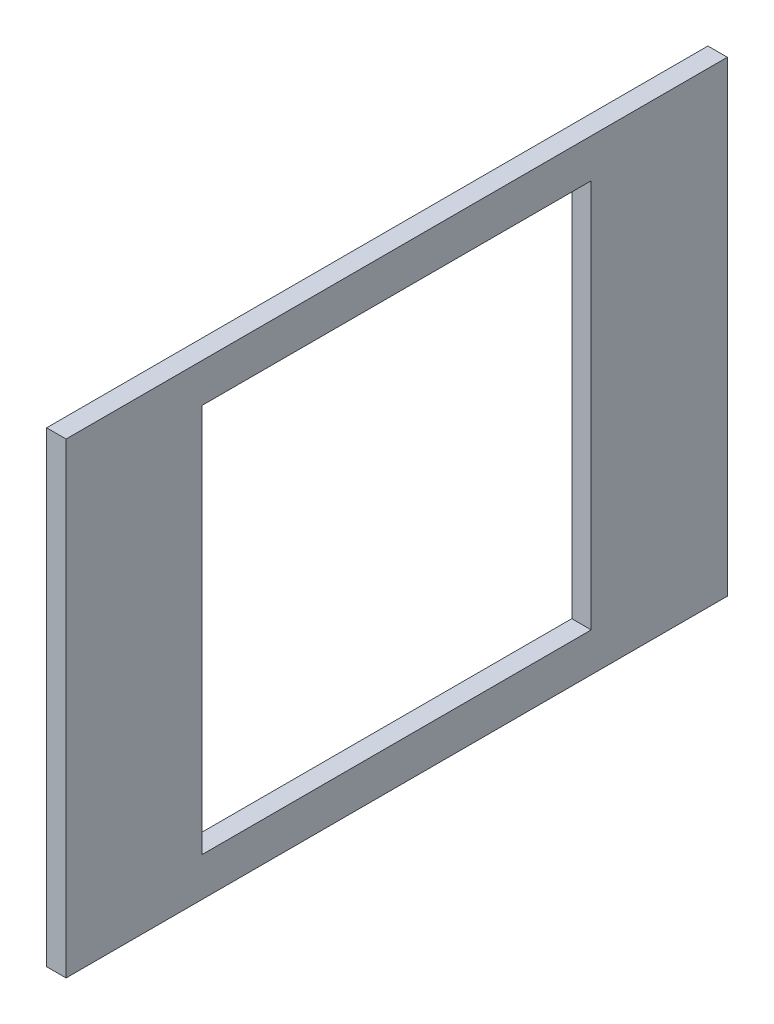
ISO-10303-21;
HEADER;
FILE_DESCRIPTION(('STEP AP214'),'2;1');
FILE_NAME('part.step','',(''),(''),'','','');
FILE_SCHEMA(('AUTOMOTIVE_DESIGN { 1 0 10303 214 1 1 1 1 }'));
ENDSEC;
DATA;
#1=APPLICATION_CONTEXT('core data for automotive mechanical design processes');
#2=APPLICATION_PROTOCOL_DEFINITION('international standard','automotive_design',2000,#1);
#3=PRODUCT_CONTEXT('',#1,'mechanical');
#4=PRODUCT('Part','Part','',(#3));
#5=PRODUCT_RELATED_PRODUCT_CATEGORY('part','',(#4));
#6=PRODUCT_DEFINITION_FORMATION('','',#4);
#7=PRODUCT_DEFINITION_CONTEXT('part definition',#1,'design');
#8=PRODUCT_DEFINITION('design','',#6,#7);
#9=PRODUCT_DEFINITION_SHAPE('','',#8);
#10=(LENGTH_UNIT() NAMED_UNIT(*) SI_UNIT(.MILLI.,.METRE.));
#11=(NAMED_UNIT(*) PLANE_ANGLE_UNIT() SI_UNIT($,.RADIAN.));
#12=(NAMED_UNIT(*) SI_UNIT($,.STERADIAN.) SOLID_ANGLE_UNIT());
#13=UNCERTAINTY_MEASURE_WITH_UNIT(LENGTH_MEASURE(1.E-05),#10,'distance_accuracy_value','');
#14=(GEOMETRIC_REPRESENTATION_CONTEXT(3) GLOBAL_UNCERTAINTY_ASSIGNED_CONTEXT((#13)) GLOBAL_UNIT_ASSIGNED_CONTEXT((#10,
#11,#12)) REPRESENTATION_CONTEXT('',''));
#15=CARTESIAN_POINT('',(0.,0.,0.));
#16=DIRECTION('',(0.,0.,1.));
#17=DIRECTION('',(1.,0.,0.));
#18=AXIS2_PLACEMENT_3D('',#15,#16,#17);
#19=CARTESIAN_POINT('',(12.7,0.,0.));
#20=DIRECTION('',(-1.,0.,0.));
#21=DIRECTION('',(0.,0.,1.));
#22=AXIS2_PLACEMENT_3D('',#19,#20,#21);
#23=PLANE('',#22);
#24=DIRECTION('',(0.,-1.,0.));
#25=VECTOR('',#24,1.);
#26=CARTESIAN_POINT('',(12.7,152.4,215.9));
#27=LINE('',#26,#25);
#28=CARTESIAN_POINT('',(12.7,152.4,215.9));
#29=VERTEX_POINT('',#28);
#30=CARTESIAN_POINT('',(12.7,-152.4,215.9));
#31=VERTEX_POINT('',#30);
#32=EDGE_CURVE('E135',#29,#31,#27,.T.);
#33=ORIENTED_EDGE('',*,*,#32,.T.);
#34=DIRECTION('',(0.,0.,-1.));
#35=VECTOR('',#34,1.);
#36=CARTESIAN_POINT('',(12.7,-152.4,-215.9));
#37=LINE('',#36,#35);
#38=CARTESIAN_POINT('',(12.7,-152.4,-215.9));
#39=VERTEX_POINT('',#38);
#40=EDGE_CURVE('E138',#31,#39,#37,.T.);
#41=ORIENTED_EDGE('',*,*,#40,.T.);
#42=DIRECTION('',(0.,1.,0.));
#43=VECTOR('',#42,1.);
#44=CARTESIAN_POINT('',(12.7,152.4,-215.9));
#45=LINE('',#44,#43);
#46=CARTESIAN_POINT('',(12.7,152.4,-215.9));
#47=VERTEX_POINT('',#46);
#48=EDGE_CURVE('E141',#39,#47,#45,.T.);
#49=ORIENTED_EDGE('',*,*,#48,.T.);
#50=DIRECTION('',(0.,0.,1.));
#51=VECTOR('',#50,1.);
#52=CARTESIAN_POINT('',(12.7,152.4,-215.9));
#53=LINE('',#52,#51);
#54=EDGE_CURVE('E143',#47,#29,#53,.T.);
#55=ORIENTED_EDGE('',*,*,#54,.T.);
#56=EDGE_LOOP('',(#33,#41,#49,#55));
#57=FACE_BOUND('',#56,.T.);
#58=DIRECTION('',(0.,-1.,0.));
#59=VECTOR('',#58,1.);
#60=CARTESIAN_POINT('',(12.7,127.,127.));
#61=LINE('',#60,#59);
#62=CARTESIAN_POINT('',(12.7,127.,127.));
#63=VERTEX_POINT('',#62);
#64=CARTESIAN_POINT('',(12.7,-127.,127.));
#65=VERTEX_POINT('',#64);
#66=EDGE_CURVE('E99',#63,#65,#61,.T.);
#67=ORIENTED_EDGE('',*,*,#66,.F.);
#68=DIRECTION('',(0.,0.,1.));
#69=VECTOR('',#68,1.);
#70=CARTESIAN_POINT('',(12.7,127.,-127.));
#71=LINE('',#70,#69);
#72=CARTESIAN_POINT('',(12.7,127.,-127.));
#73=VERTEX_POINT('',#72);
#74=EDGE_CURVE('E121',#73,#63,#71,.T.);
#75=ORIENTED_EDGE('',*,*,#74,.F.);
#76=DIRECTION('',(0.,1.,0.));
#77=VECTOR('',#76,1.);
#78=CARTESIAN_POINT('',(12.7,127.,-127.));
#79=LINE('',#78,#77);
#80=CARTESIAN_POINT('',(12.7,-127.,-127.));
#81=VERTEX_POINT('',#80);
#82=EDGE_CURVE('E119',#81,#73,#79,.T.);
#83=ORIENTED_EDGE('',*,*,#82,.F.);
#84=DIRECTION('',(0.,0.,-1.));
#85=VECTOR('',#84,1.);
#86=CARTESIAN_POINT('',(12.7,-127.,-127.));
#87=LINE('',#86,#85);
#88=EDGE_CURVE('E107',#65,#81,#87,.T.);
#89=ORIENTED_EDGE('',*,*,#88,.F.);
#90=EDGE_LOOP('',(#67,#75,#83,#89));
#91=FACE_BOUND('',#90,.T.);
#92=ADVANCED_FACE('F34',(#57,#91),#23,.F.);
#93=CARTESIAN_POINT('',(0.,0.,0.));
#94=DIRECTION('',(-1.,0.,0.));
#95=DIRECTION('',(0.,0.,1.));
#96=AXIS2_PLACEMENT_3D('',#93,#94,#95);
#97=PLANE('',#96);
#98=DIRECTION('',(0.,-1.,0.));
#99=VECTOR('',#98,1.);
#100=CARTESIAN_POINT('',(0.,152.4,215.9));
#101=LINE('',#100,#99);
#102=CARTESIAN_POINT('',(0.,152.4,215.9));
#103=VERTEX_POINT('',#102);
#104=CARTESIAN_POINT('',(0.,-152.4,215.9));
#105=VERTEX_POINT('',#104);
#106=EDGE_CURVE('E115',#103,#105,#101,.T.);
#107=ORIENTED_EDGE('',*,*,#106,.F.);
#108=DIRECTION('',(0.,0.,1.));
#109=VECTOR('',#108,1.);
#110=CARTESIAN_POINT('',(0.,152.4,-215.9));
#111=LINE('',#110,#109);
#112=CARTESIAN_POINT('',(0.,152.4,-215.9));
#113=VERTEX_POINT('',#112);
#114=EDGE_CURVE('E139',#113,#103,#111,.T.);
#115=ORIENTED_EDGE('',*,*,#114,.F.);
#116=DIRECTION('',(0.,1.,0.));
#117=VECTOR('',#116,1.);
#118=CARTESIAN_POINT('',(0.,152.4,-215.9));
#119=LINE('',#118,#117);
#120=CARTESIAN_POINT('',(0.,-152.4,-215.9));
#121=VERTEX_POINT('',#120);
#122=EDGE_CURVE('E150',#121,#113,#119,.T.);
#123=ORIENTED_EDGE('',*,*,#122,.F.);
#124=DIRECTION('',(0.,0.,-1.));
#125=VECTOR('',#124,1.);
#126=CARTESIAN_POINT('',(0.,-152.4,-215.9));
#127=LINE('',#126,#125);
#128=EDGE_CURVE('E148',#105,#121,#127,.T.);
#129=ORIENTED_EDGE('',*,*,#128,.F.);
#130=EDGE_LOOP('',(#107,#115,#123,#129));
#131=FACE_BOUND('',#130,.T.);
#132=DIRECTION('',(0.,0.,1.));
#133=VECTOR('',#132,1.);
#134=CARTESIAN_POINT('',(0.,127.,-127.));
#135=LINE('',#134,#133);
#136=CARTESIAN_POINT('',(0.,127.,-127.));
#137=VERTEX_POINT('',#136);
#138=CARTESIAN_POINT('',(0.,127.,127.));
#139=VERTEX_POINT('',#138);
#140=EDGE_CURVE('E108',#137,#139,#135,.T.);
#141=ORIENTED_EDGE('',*,*,#140,.T.);
#142=DIRECTION('',(0.,-1.,0.));
#143=VECTOR('',#142,1.);
#144=CARTESIAN_POINT('',(0.,127.,127.));
#145=LINE('',#144,#143);
#146=CARTESIAN_POINT('',(0.,-127.,127.));
#147=VERTEX_POINT('',#146);
#148=EDGE_CURVE('E57',#139,#147,#145,.T.);
#149=ORIENTED_EDGE('',*,*,#148,.T.);
#150=DIRECTION('',(0.,0.,-1.));
#151=VECTOR('',#150,1.);
#152=CARTESIAN_POINT('',(0.,-127.,-127.));
#153=LINE('',#152,#151);
#154=CARTESIAN_POINT('',(0.,-127.,-127.));
#155=VERTEX_POINT('',#154);
#156=EDGE_CURVE('E114',#147,#155,#153,.T.);
#157=ORIENTED_EDGE('',*,*,#156,.T.);
#158=DIRECTION('',(0.,1.,0.));
#159=VECTOR('',#158,1.);
#160=CARTESIAN_POINT('',(0.,127.,-127.));
#161=LINE('',#160,#159);
#162=EDGE_CURVE('E127',#155,#137,#161,.T.);
#163=ORIENTED_EDGE('',*,*,#162,.T.);
#164=EDGE_LOOP('',(#141,#149,#157,#163));
#165=FACE_BOUND('',#164,.T.);
#166=ADVANCED_FACE('F168',(#131,#165),#97,.T.);
#167=CARTESIAN_POINT('',(12.7,152.4,215.9));
#168=DIRECTION('',(0.,0.,-1.));
#169=DIRECTION('',(0.,1.,0.));
#170=AXIS2_PLACEMENT_3D('',#167,#168,#169);
#171=PLANE('',#170);
#172=ORIENTED_EDGE('',*,*,#106,.T.);
#173=DIRECTION('',(-1.,0.,0.));
#174=VECTOR('',#173,1.);
#175=CARTESIAN_POINT('',(12.7,-152.4,215.9));
#176=LINE('',#175,#174);
#177=EDGE_CURVE('E11',#31,#105,#176,.T.);
#178=ORIENTED_EDGE('',*,*,#177,.F.);
#179=ORIENTED_EDGE('',*,*,#32,.F.);
#180=DIRECTION('',(-1.,0.,0.));
#181=VECTOR('',#180,1.);
#182=CARTESIAN_POINT('',(12.7,152.4,215.9));
#183=LINE('',#182,#181);
#184=EDGE_CURVE('E145',#29,#103,#183,.T.);
#185=ORIENTED_EDGE('',*,*,#184,.T.);
#186=EDGE_LOOP('',(#172,#178,#179,#185));
#187=FACE_BOUND('',#186,.T.);
#188=ADVANCED_FACE('F36',(#187),#171,.F.);
#189=CARTESIAN_POINT('',(12.7,-152.4,-215.9));
#190=DIRECTION('',(0.,1.,0.));
#191=DIRECTION('',(0.,0.,1.));
#192=AXIS2_PLACEMENT_3D('',#189,#190,#191);
#193=PLANE('',#192);
#194=ORIENTED_EDGE('',*,*,#128,.T.);
#195=DIRECTION('',(-1.,0.,0.));
#196=VECTOR('',#195,1.);
#197=CARTESIAN_POINT('',(12.7,-152.4,-215.9));
#198=LINE('',#197,#196);
#199=EDGE_CURVE('E42',#39,#121,#198,.T.);
#200=ORIENTED_EDGE('',*,*,#199,.F.);
#201=ORIENTED_EDGE('',*,*,#40,.F.);
#202=ORIENTED_EDGE('',*,*,#177,.T.);
#203=EDGE_LOOP('',(#194,#200,#201,#202));
#204=FACE_BOUND('',#203,.T.);
#205=ADVANCED_FACE('F178',(#204),#193,.F.);
#206=CARTESIAN_POINT('',(12.7,152.4,-215.9));
#207=DIRECTION('',(0.,0.,1.));
#208=DIRECTION('',(0.,-1.,0.));
#209=AXIS2_PLACEMENT_3D('',#206,#207,#208);
#210=PLANE('',#209);
#211=ORIENTED_EDGE('',*,*,#122,.T.);
#212=DIRECTION('',(-1.,0.,0.));
#213=VECTOR('',#212,1.);
#214=CARTESIAN_POINT('',(12.7,152.4,-215.9));
#215=LINE('',#214,#213);
#216=EDGE_CURVE('E155',#47,#113,#215,.T.);
#217=ORIENTED_EDGE('',*,*,#216,.F.);
#218=ORIENTED_EDGE('',*,*,#48,.F.);
#219=ORIENTED_EDGE('',*,*,#199,.T.);
#220=EDGE_LOOP('',(#211,#217,#218,#219));
#221=FACE_BOUND('',#220,.T.);
#222=ADVANCED_FACE('F162',(#221),#210,.F.);
#223=CARTESIAN_POINT('',(12.7,152.4,-215.9));
#224=DIRECTION('',(0.,-1.,0.));
#225=DIRECTION('',(0.,0.,-1.));
#226=AXIS2_PLACEMENT_3D('',#223,#224,#225);
#227=PLANE('',#226);
#228=ORIENTED_EDGE('',*,*,#114,.T.);
#229=ORIENTED_EDGE('',*,*,#184,.F.);
#230=ORIENTED_EDGE('',*,*,#54,.F.);
#231=ORIENTED_EDGE('',*,*,#216,.T.);
#232=EDGE_LOOP('',(#228,#229,#230,#231));
#233=FACE_BOUND('',#232,.T.);
#234=ADVANCED_FACE('F172',(#233),#227,.F.);
#235=CARTESIAN_POINT('',(12.7,127.,127.));
#236=DIRECTION('',(0.,0.,-1.));
#237=DIRECTION('',(-1.,0.,0.));
#238=AXIS2_PLACEMENT_3D('',#235,#236,#237);
#239=PLANE('',#238);
#240=ORIENTED_EDGE('',*,*,#148,.F.);
#241=DIRECTION('',(-1.,0.,0.));
#242=VECTOR('',#241,1.);
#243=CARTESIAN_POINT('',(12.7,127.,127.));
#244=LINE('',#243,#242);
#245=EDGE_CURVE('E103',#63,#139,#244,.T.);
#246=ORIENTED_EDGE('',*,*,#245,.F.);
#247=ORIENTED_EDGE('',*,*,#66,.T.);
#248=DIRECTION('',(-1.,0.,0.));
#249=VECTOR('',#248,1.);
#250=CARTESIAN_POINT('',(12.7,-127.,127.));
#251=LINE('',#250,#249);
#252=EDGE_CURVE('E102',#65,#147,#251,.T.);
#253=ORIENTED_EDGE('',*,*,#252,.T.);
#254=EDGE_LOOP('',(#240,#246,#247,#253));
#255=FACE_BOUND('',#254,.T.);
#256=ADVANCED_FACE('F101',(#255),#239,.T.);
#257=CARTESIAN_POINT('',(12.7,-127.,-127.));
#258=DIRECTION('',(0.,1.,0.));
#259=DIRECTION('',(0.,0.,1.));
#260=AXIS2_PLACEMENT_3D('',#257,#258,#259);
#261=PLANE('',#260);
#262=ORIENTED_EDGE('',*,*,#156,.F.);
#263=ORIENTED_EDGE('',*,*,#252,.F.);
#264=ORIENTED_EDGE('',*,*,#88,.T.);
#265=DIRECTION('',(-1.,0.,0.));
#266=VECTOR('',#265,1.);
#267=CARTESIAN_POINT('',(12.7,-127.,-127.));
#268=LINE('',#267,#266);
#269=EDGE_CURVE('E116',#81,#155,#268,.T.);
#270=ORIENTED_EDGE('',*,*,#269,.T.);
#271=EDGE_LOOP('',(#262,#263,#264,#270));
#272=FACE_BOUND('',#271,.T.);
#273=ADVANCED_FACE('F111',(#272),#261,.T.);
#274=CARTESIAN_POINT('',(12.7,127.,-127.));
#275=DIRECTION('',(0.,0.,1.));
#276=DIRECTION('',(0.,-1.,0.));
#277=AXIS2_PLACEMENT_3D('',#274,#275,#276);
#278=PLANE('',#277);
#279=ORIENTED_EDGE('',*,*,#162,.F.);
#280=ORIENTED_EDGE('',*,*,#269,.F.);
#281=ORIENTED_EDGE('',*,*,#82,.T.);
#282=DIRECTION('',(-1.,0.,0.));
#283=VECTOR('',#282,1.);
#284=CARTESIAN_POINT('',(12.7,127.,-127.));
#285=LINE('',#284,#283);
#286=EDGE_CURVE('E49',#73,#137,#285,.T.);
#287=ORIENTED_EDGE('',*,*,#286,.T.);
#288=EDGE_LOOP('',(#279,#280,#281,#287));
#289=FACE_BOUND('',#288,.T.);
#290=ADVANCED_FACE('F201',(#289),#278,.T.);
#291=CARTESIAN_POINT('',(12.7,127.,-127.));
#292=DIRECTION('',(0.,-1.,0.));
#293=DIRECTION('',(0.,0.,-1.));
#294=AXIS2_PLACEMENT_3D('',#291,#292,#293);
#295=PLANE('',#294);
#296=ORIENTED_EDGE('',*,*,#140,.F.);
#297=ORIENTED_EDGE('',*,*,#286,.F.);
#298=ORIENTED_EDGE('',*,*,#74,.T.);
#299=ORIENTED_EDGE('',*,*,#245,.T.);
#300=EDGE_LOOP('',(#296,#297,#298,#299));
#301=FACE_BOUND('',#300,.T.);
#302=ADVANCED_FACE('F205',(#301),#295,.T.);
#303=CLOSED_SHELL('',(#92,#166,#188,#205,#222,#234,#256,#273,#290,#302));
#304=MANIFOLD_SOLID_BREP('B2',#303);
#305=ADVANCED_BREP_SHAPE_REPRESENTATION('',(#18,#304),#14);
#306=SHAPE_DEFINITION_REPRESENTATION(#9,#305);
ENDSEC;
END-ISO-10303-21;
